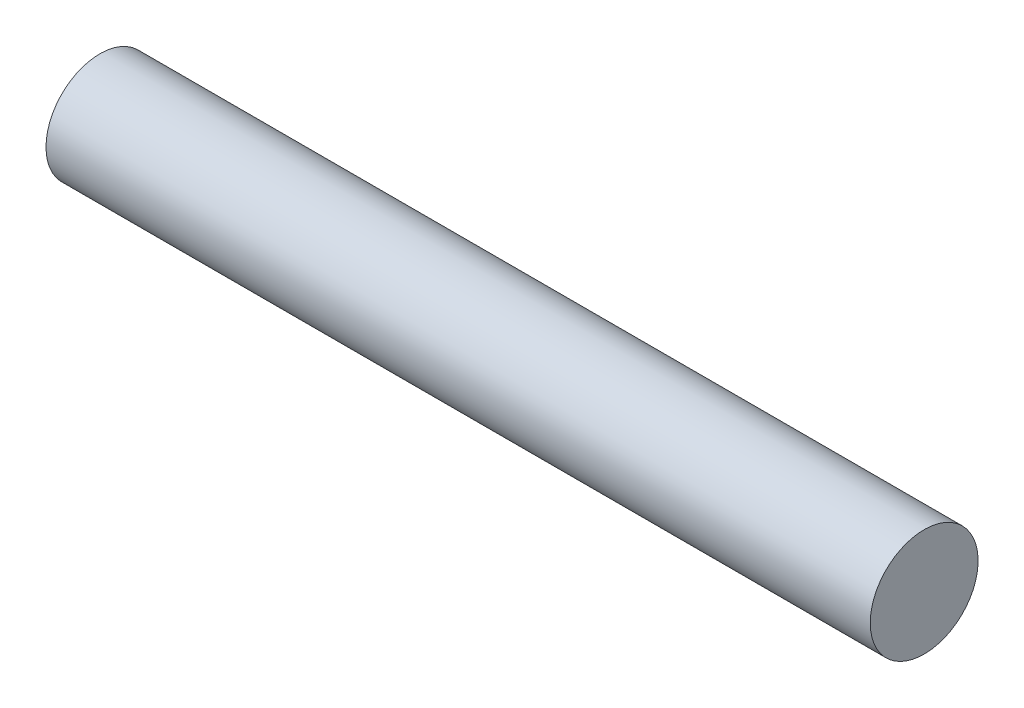
ISO-10303-21;
HEADER;
FILE_DESCRIPTION(('STEP AP214'),'2;1');
FILE_NAME('part.step','',(''),(''),'','','');
FILE_SCHEMA(('AUTOMOTIVE_DESIGN { 1 0 10303 214 1 1 1 1 }'));
ENDSEC;
DATA;
#1=APPLICATION_CONTEXT('core data for automotive mechanical design processes');
#2=APPLICATION_PROTOCOL_DEFINITION('international standard','automotive_design',2000,#1);
#3=PRODUCT_CONTEXT('',#1,'mechanical');
#4=PRODUCT('Part','Part','',(#3));
#5=PRODUCT_RELATED_PRODUCT_CATEGORY('part','',(#4));
#6=PRODUCT_DEFINITION_FORMATION('','',#4);
#7=PRODUCT_DEFINITION_CONTEXT('part definition',#1,'design');
#8=PRODUCT_DEFINITION('design','',#6,#7);
#9=PRODUCT_DEFINITION_SHAPE('','',#8);
#10=(LENGTH_UNIT() NAMED_UNIT(*) SI_UNIT(.MILLI.,.METRE.));
#11=(NAMED_UNIT(*) PLANE_ANGLE_UNIT() SI_UNIT($,.RADIAN.));
#12=(NAMED_UNIT(*) SI_UNIT($,.STERADIAN.) SOLID_ANGLE_UNIT());
#13=UNCERTAINTY_MEASURE_WITH_UNIT(LENGTH_MEASURE(1.E-05),#10,'distance_accuracy_value','');
#14=(GEOMETRIC_REPRESENTATION_CONTEXT(3) GLOBAL_UNCERTAINTY_ASSIGNED_CONTEXT((#13)) GLOBAL_UNIT_ASSIGNED_CONTEXT((#10,
#11,#12)) REPRESENTATION_CONTEXT('',''));
#15=CARTESIAN_POINT('',(0.,0.,0.));
#16=DIRECTION('',(0.,0.,1.));
#17=DIRECTION('',(1.,0.,0.));
#18=AXIS2_PLACEMENT_3D('',#15,#16,#17);
#19=CARTESIAN_POINT('',(0.,0.,0.));
#20=DIRECTION('',(1.,0.,0.));
#21=DIRECTION('',(0.,0.,-1.));
#22=AXIS2_PLACEMENT_3D('',#19,#20,#21);
#23=PLANE('',#22);
#24=CARTESIAN_POINT('',(0.,0.,0.));
#25=DIRECTION('',(-1.,0.,0.));
#26=DIRECTION('',(0.,0.,1.));
#27=AXIS2_PLACEMENT_3D('',#24,#25,#26);
#28=CIRCLE('',#27,7.);
#29=CARTESIAN_POINT('',(0.,0.,7.));
#30=VERTEX_POINT('',#29);
#31=EDGE_CURVE('E10',#30,#30,#28,.T.);
#32=ORIENTED_EDGE('',*,*,#31,.T.);
#33=EDGE_LOOP('',(#32));
#34=FACE_BOUND('',#33,.T.);
#35=ADVANCED_FACE('F41',(#34),#23,.F.);
#36=CARTESIAN_POINT('',(0.,0.,0.));
#37=DIRECTION('',(-1.,0.,0.));
#38=DIRECTION('',(0.,0.,1.));
#39=AXIS2_PLACEMENT_3D('',#36,#37,#38);
#40=CYLINDRICAL_SURFACE('',#39,7.);
#41=ORIENTED_EDGE('',*,*,#31,.F.);
#42=EDGE_LOOP('',(#41));
#43=FACE_BOUND('',#42,.T.);
#44=CARTESIAN_POINT('',(107.,0.,0.));
#45=DIRECTION('',(-1.,0.,0.));
#46=DIRECTION('',(0.,0.,1.));
#47=AXIS2_PLACEMENT_3D('',#44,#45,#46);
#48=CIRCLE('',#47,7.);
#49=CARTESIAN_POINT('',(107.,0.,7.));
#50=VERTEX_POINT('',#49);
#51=EDGE_CURVE('E47',#50,#50,#48,.T.);
#52=ORIENTED_EDGE('',*,*,#51,.T.);
#53=EDGE_LOOP('',(#52));
#54=FACE_BOUND('',#53,.T.);
#55=ADVANCED_FACE('F53',(#43,#54),#40,.T.);
#56=CARTESIAN_POINT('',(107.,7.,0.));
#57=DIRECTION('',(-1.,0.,0.));
#58=DIRECTION('',(0.,0.,1.));
#59=AXIS2_PLACEMENT_3D('',#56,#57,#58);
#60=PLANE('',#59);
#61=ORIENTED_EDGE('',*,*,#51,.F.);
#62=EDGE_LOOP('',(#61));
#63=FACE_BOUND('',#62,.T.);
#64=ADVANCED_FACE('F55',(#63),#60,.F.);
#65=CLOSED_SHELL('',(#35,#55,#64));
#66=MANIFOLD_SOLID_BREP('B2',#65);
#67=ADVANCED_BREP_SHAPE_REPRESENTATION('',(#18,#66),#14);
#68=SHAPE_DEFINITION_REPRESENTATION(#9,#67);
ENDSEC;
END-ISO-10303-21;
